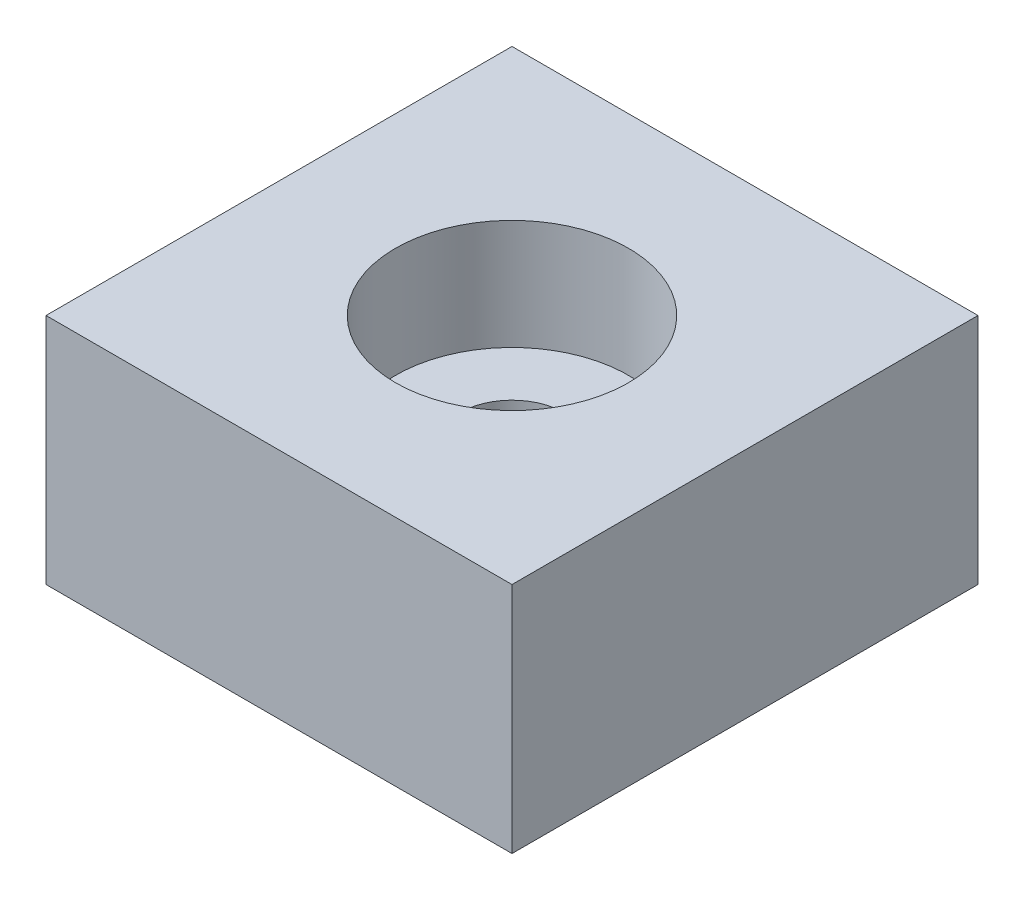
ISO-10303-21;
HEADER;
FILE_DESCRIPTION(('STEP AP214'),'2;1');
FILE_NAME('part.step','',(''),(''),'','','');
FILE_SCHEMA(('AUTOMOTIVE_DESIGN { 1 0 10303 214 1 1 1 1 }'));
ENDSEC;
DATA;
#1=APPLICATION_CONTEXT('core data for automotive mechanical design processes');
#2=APPLICATION_PROTOCOL_DEFINITION('international standard','automotive_design',2000,#1);
#3=PRODUCT_CONTEXT('',#1,'mechanical');
#4=PRODUCT('Part','Part','',(#3));
#5=PRODUCT_RELATED_PRODUCT_CATEGORY('part','',(#4));
#6=PRODUCT_DEFINITION_FORMATION('','',#4);
#7=PRODUCT_DEFINITION_CONTEXT('part definition',#1,'design');
#8=PRODUCT_DEFINITION('design','',#6,#7);
#9=PRODUCT_DEFINITION_SHAPE('','',#8);
#10=(LENGTH_UNIT() NAMED_UNIT(*) SI_UNIT(.MILLI.,.METRE.));
#11=(NAMED_UNIT(*) PLANE_ANGLE_UNIT() SI_UNIT($,.RADIAN.));
#12=(NAMED_UNIT(*) SI_UNIT($,.STERADIAN.) SOLID_ANGLE_UNIT());
#13=UNCERTAINTY_MEASURE_WITH_UNIT(LENGTH_MEASURE(1.E-05),#10,'distance_accuracy_value','');
#14=(GEOMETRIC_REPRESENTATION_CONTEXT(3) GLOBAL_UNCERTAINTY_ASSIGNED_CONTEXT((#13)) GLOBAL_UNIT_ASSIGNED_CONTEXT((#10,
#11,#12)) REPRESENTATION_CONTEXT('',''));
#15=CARTESIAN_POINT('',(0.,0.,0.));
#16=DIRECTION('',(0.,0.,1.));
#17=DIRECTION('',(1.,0.,0.));
#18=AXIS2_PLACEMENT_3D('',#15,#16,#17);
#19=CARTESIAN_POINT('',(0.,19.05,0.));
#20=DIRECTION('',(0.,1.,0.));
#21=DIRECTION('',(0.,0.,1.));
#22=AXIS2_PLACEMENT_3D('',#19,#20,#21);
#23=CYLINDRICAL_SURFACE('',#22,4.25);
#24=CARTESIAN_POINT('',(0.,0.,0.));
#25=DIRECTION('',(0.,1.,0.));
#26=DIRECTION('',(0.,0.,1.));
#27=AXIS2_PLACEMENT_3D('',#24,#25,#26);
#28=CIRCLE('',#27,4.25);
#29=CARTESIAN_POINT('',(0.,0.,4.25));
#30=VERTEX_POINT('',#29);
#31=EDGE_CURVE('E122',#30,#30,#28,.T.);
#32=ORIENTED_EDGE('',*,*,#31,.F.);
#33=EDGE_LOOP('',(#32));
#34=FACE_BOUND('',#33,.T.);
#35=CARTESIAN_POINT('',(0.,10.05,0.));
#36=DIRECTION('',(0.,1.,0.));
#37=DIRECTION('',(0.,0.,1.));
#38=AXIS2_PLACEMENT_3D('',#35,#36,#37);
#39=CIRCLE('',#38,4.25);
#40=CARTESIAN_POINT('',(0.,10.05,4.25));
#41=VERTEX_POINT('',#40);
#42=EDGE_CURVE('E57',#41,#41,#39,.F.);
#43=ORIENTED_EDGE('',*,*,#42,.F.);
#44=EDGE_LOOP('',(#43));
#45=FACE_BOUND('',#44,.T.);
#46=ADVANCED_FACE('F53',(#34,#45),#23,.F.);
#47=CARTESIAN_POINT('',(19.05,19.05,19.05));
#48=DIRECTION('',(-1.,0.,0.));
#49=DIRECTION('',(0.,0.,1.));
#50=AXIS2_PLACEMENT_3D('',#47,#48,#49);
#51=PLANE('',#50);
#52=DIRECTION('',(0.,0.,-1.));
#53=VECTOR('',#52,1.);
#54=CARTESIAN_POINT('',(19.05,0.,19.05));
#55=LINE('',#54,#53);
#56=CARTESIAN_POINT('',(19.05,0.,19.05));
#57=VERTEX_POINT('',#56);
#58=CARTESIAN_POINT('',(19.05,0.,-19.05));
#59=VERTEX_POINT('',#58);
#60=EDGE_CURVE('E119',#57,#59,#55,.T.);
#61=ORIENTED_EDGE('',*,*,#60,.T.);
#62=DIRECTION('',(0.,-1.,0.));
#63=VECTOR('',#62,1.);
#64=CARTESIAN_POINT('',(19.05,19.05,-19.05));
#65=LINE('',#64,#63);
#66=CARTESIAN_POINT('',(19.05,19.05,-19.05));
#67=VERTEX_POINT('',#66);
#68=EDGE_CURVE('E11',#67,#59,#65,.T.);
#69=ORIENTED_EDGE('',*,*,#68,.F.);
#70=DIRECTION('',(0.,0.,-1.));
#71=VECTOR('',#70,1.);
#72=CARTESIAN_POINT('',(19.05,19.05,19.05));
#73=LINE('',#72,#71);
#74=CARTESIAN_POINT('',(19.05,19.05,19.05));
#75=VERTEX_POINT('',#74);
#76=EDGE_CURVE('E106',#75,#67,#73,.T.);
#77=ORIENTED_EDGE('',*,*,#76,.F.);
#78=DIRECTION('',(0.,-1.,0.));
#79=VECTOR('',#78,1.);
#80=CARTESIAN_POINT('',(19.05,19.05,19.05));
#81=LINE('',#80,#79);
#82=EDGE_CURVE('E115',#75,#57,#81,.T.);
#83=ORIENTED_EDGE('',*,*,#82,.T.);
#84=EDGE_LOOP('',(#61,#69,#77,#83));
#85=FACE_BOUND('',#84,.T.);
#86=ADVANCED_FACE('F55',(#85),#51,.F.);
#87=CARTESIAN_POINT('',(-19.05,19.05,-19.05));
#88=DIRECTION('',(0.,0.,1.));
#89=DIRECTION('',(1.,0.,0.));
#90=AXIS2_PLACEMENT_3D('',#87,#88,#89);
#91=PLANE('',#90);
#92=DIRECTION('',(-1.,0.,0.));
#93=VECTOR('',#92,1.);
#94=CARTESIAN_POINT('',(-19.05,0.,-19.05));
#95=LINE('',#94,#93);
#96=CARTESIAN_POINT('',(-19.05,0.,-19.05));
#97=VERTEX_POINT('',#96);
#98=EDGE_CURVE('E110',#59,#97,#95,.T.);
#99=ORIENTED_EDGE('',*,*,#98,.T.);
#100=DIRECTION('',(0.,-1.,0.));
#101=VECTOR('',#100,1.);
#102=CARTESIAN_POINT('',(-19.05,19.05,-19.05));
#103=LINE('',#102,#101);
#104=CARTESIAN_POINT('',(-19.05,19.05,-19.05));
#105=VERTEX_POINT('',#104);
#106=EDGE_CURVE('E63',#105,#97,#103,.T.);
#107=ORIENTED_EDGE('',*,*,#106,.F.);
#108=DIRECTION('',(-1.,0.,0.));
#109=VECTOR('',#108,1.);
#110=CARTESIAN_POINT('',(-19.05,19.05,-19.05));
#111=LINE('',#110,#109);
#112=EDGE_CURVE('E101',#67,#105,#111,.T.);
#113=ORIENTED_EDGE('',*,*,#112,.F.);
#114=ORIENTED_EDGE('',*,*,#68,.T.);
#115=EDGE_LOOP('',(#99,#107,#113,#114));
#116=FACE_BOUND('',#115,.T.);
#117=ADVANCED_FACE('F109',(#116),#91,.F.);
#118=CARTESIAN_POINT('',(-19.05,19.05,19.05));
#119=DIRECTION('',(1.,0.,0.));
#120=DIRECTION('',(0.,0.,-1.));
#121=AXIS2_PLACEMENT_3D('',#118,#119,#120);
#122=PLANE('',#121);
#123=DIRECTION('',(0.,0.,1.));
#124=VECTOR('',#123,1.);
#125=CARTESIAN_POINT('',(-19.05,0.,19.05));
#126=LINE('',#125,#124);
#127=CARTESIAN_POINT('',(-19.05,0.,19.05));
#128=VERTEX_POINT('',#127);
#129=EDGE_CURVE('E88',#97,#128,#126,.T.);
#130=ORIENTED_EDGE('',*,*,#129,.T.);
#131=DIRECTION('',(0.,-1.,0.));
#132=VECTOR('',#131,1.);
#133=CARTESIAN_POINT('',(-19.05,19.05,19.05));
#134=LINE('',#133,#132);
#135=CARTESIAN_POINT('',(-19.05,19.05,19.05));
#136=VERTEX_POINT('',#135);
#137=EDGE_CURVE('E111',#136,#128,#134,.T.);
#138=ORIENTED_EDGE('',*,*,#137,.F.);
#139=DIRECTION('',(0.,0.,1.));
#140=VECTOR('',#139,1.);
#141=CARTESIAN_POINT('',(-19.05,19.05,19.05));
#142=LINE('',#141,#140);
#143=EDGE_CURVE('E104',#105,#136,#142,.T.);
#144=ORIENTED_EDGE('',*,*,#143,.F.);
#145=ORIENTED_EDGE('',*,*,#106,.T.);
#146=EDGE_LOOP('',(#130,#138,#144,#145));
#147=FACE_BOUND('',#146,.T.);
#148=ADVANCED_FACE('F113',(#147),#122,.F.);
#149=CARTESIAN_POINT('',(-19.05,19.05,19.05));
#150=DIRECTION('',(0.,0.,-1.));
#151=DIRECTION('',(-1.,0.,0.));
#152=AXIS2_PLACEMENT_3D('',#149,#150,#151);
#153=PLANE('',#152);
#154=DIRECTION('',(1.,0.,0.));
#155=VECTOR('',#154,1.);
#156=CARTESIAN_POINT('',(-19.05,0.,19.05));
#157=LINE('',#156,#155);
#158=EDGE_CURVE('E94',#128,#57,#157,.T.);
#159=ORIENTED_EDGE('',*,*,#158,.T.);
#160=ORIENTED_EDGE('',*,*,#82,.F.);
#161=DIRECTION('',(1.,0.,0.));
#162=VECTOR('',#161,1.);
#163=CARTESIAN_POINT('',(-19.05,19.05,19.05));
#164=LINE('',#163,#162);
#165=EDGE_CURVE('E71',#136,#75,#164,.T.);
#166=ORIENTED_EDGE('',*,*,#165,.F.);
#167=ORIENTED_EDGE('',*,*,#137,.T.);
#168=EDGE_LOOP('',(#159,#160,#166,#167));
#169=FACE_BOUND('',#168,.T.);
#170=ADVANCED_FACE('F127',(#169),#153,.F.);
#171=CARTESIAN_POINT('',(0.,19.05,0.));
#172=DIRECTION('',(0.,-1.,0.));
#173=DIRECTION('',(0.,0.,-1.));
#174=AXIS2_PLACEMENT_3D('',#171,#172,#173);
#175=PLANE('',#174);
#176=CARTESIAN_POINT('',(0.,19.05,0.));
#177=DIRECTION('',(0.,1.,0.));
#178=DIRECTION('',(0.,0.,1.));
#179=AXIS2_PLACEMENT_3D('',#176,#177,#178);
#180=CIRCLE('',#179,9.52500000000001);
#181=CARTESIAN_POINT('',(0.,19.05,9.52500000000001));
#182=VERTEX_POINT('',#181);
#183=EDGE_CURVE('E135',#182,#182,#180,.T.);
#184=ORIENTED_EDGE('',*,*,#183,.F.);
#185=EDGE_LOOP('',(#184));
#186=FACE_BOUND('',#185,.T.);
#187=ORIENTED_EDGE('',*,*,#76,.T.);
#188=ORIENTED_EDGE('',*,*,#112,.T.);
#189=ORIENTED_EDGE('',*,*,#143,.T.);
#190=ORIENTED_EDGE('',*,*,#165,.T.);
#191=EDGE_LOOP('',(#187,#188,#189,#190));
#192=FACE_BOUND('',#191,.T.);
#193=ADVANCED_FACE('F102',(#186,#192),#175,.F.);
#194=CARTESIAN_POINT('',(0.,0.,0.));
#195=DIRECTION('',(0.,-1.,0.));
#196=DIRECTION('',(0.,0.,-1.));
#197=AXIS2_PLACEMENT_3D('',#194,#195,#196);
#198=PLANE('',#197);
#199=ORIENTED_EDGE('',*,*,#31,.T.);
#200=EDGE_LOOP('',(#199));
#201=FACE_BOUND('',#200,.T.);
#202=ORIENTED_EDGE('',*,*,#60,.F.);
#203=ORIENTED_EDGE('',*,*,#158,.F.);
#204=ORIENTED_EDGE('',*,*,#129,.F.);
#205=ORIENTED_EDGE('',*,*,#98,.F.);
#206=EDGE_LOOP('',(#202,#203,#204,#205));
#207=FACE_BOUND('',#206,.T.);
#208=ADVANCED_FACE('F130',(#201,#207),#198,.T.);
#209=CARTESIAN_POINT('',(0.,10.05,0.));
#210=DIRECTION('',(0.,1.,0.));
#211=DIRECTION('',(0.,0.,1.));
#212=AXIS2_PLACEMENT_3D('',#209,#210,#211);
#213=PLANE('',#212);
#214=CARTESIAN_POINT('',(0.,10.05,0.));
#215=DIRECTION('',(0.,1.,0.));
#216=DIRECTION('',(0.,0.,1.));
#217=AXIS2_PLACEMENT_3D('',#214,#215,#216);
#218=CIRCLE('',#217,9.52500000000001);
#219=CARTESIAN_POINT('',(0.,10.05,9.52500000000001));
#220=VERTEX_POINT('',#219);
#221=EDGE_CURVE('E138',#220,#220,#218,.T.);
#222=ORIENTED_EDGE('',*,*,#221,.T.);
#223=EDGE_LOOP('',(#222));
#224=FACE_BOUND('',#223,.T.);
#225=ORIENTED_EDGE('',*,*,#42,.T.);
#226=EDGE_LOOP('',(#225));
#227=FACE_BOUND('',#226,.T.);
#228=ADVANCED_FACE('F145',(#224,#227),#213,.T.);
#229=CARTESIAN_POINT('',(0.,10.05,0.));
#230=DIRECTION('',(0.,1.,0.));
#231=DIRECTION('',(0.,0.,1.));
#232=AXIS2_PLACEMENT_3D('',#229,#230,#231);
#233=CYLINDRICAL_SURFACE('',#232,9.52500000000001);
#234=ORIENTED_EDGE('',*,*,#221,.F.);
#235=EDGE_LOOP('',(#234));
#236=FACE_BOUND('',#235,.T.);
#237=ORIENTED_EDGE('',*,*,#183,.T.);
#238=EDGE_LOOP('',(#237));
#239=FACE_BOUND('',#238,.T.);
#240=ADVANCED_FACE('F156',(#236,#239),#233,.F.);
#241=CLOSED_SHELL('',(#46,#86,#117,#148,#170,#193,#208,#228,#240));
#242=MANIFOLD_SOLID_BREP('B2',#241);
#243=ADVANCED_BREP_SHAPE_REPRESENTATION('',(#18,#242),#14);
#244=SHAPE_DEFINITION_REPRESENTATION(#9,#243);
ENDSEC;
END-ISO-10303-21;
